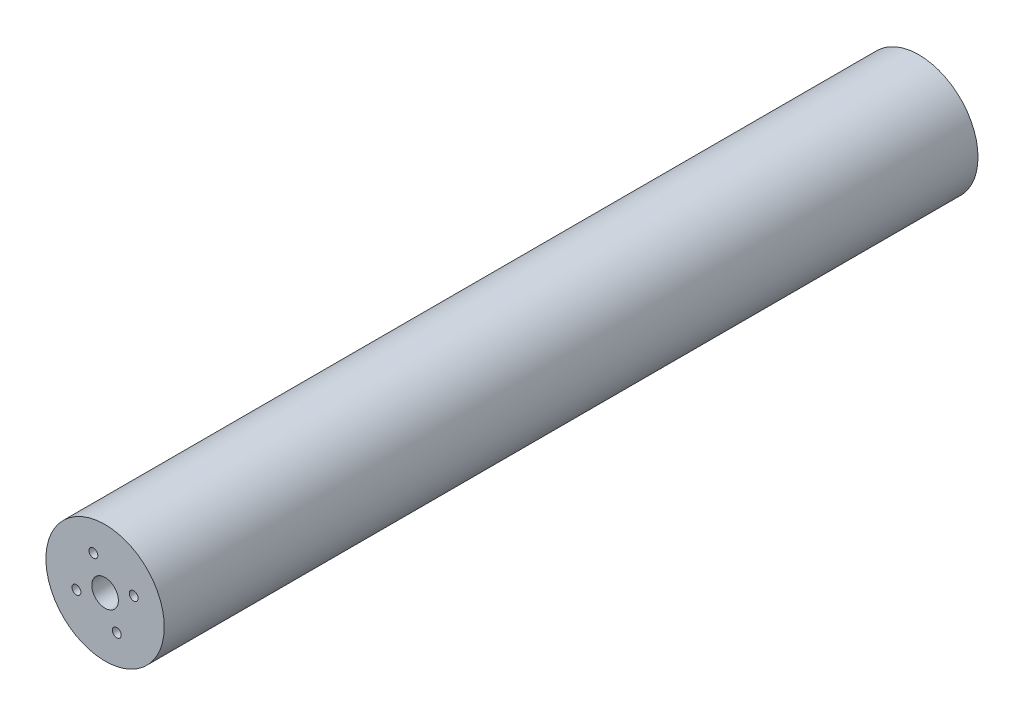
ISO-10303-21;
HEADER;
FILE_DESCRIPTION(('STEP AP214'),'2;1');
FILE_NAME('part.step','',(''),(''),'','','');
FILE_SCHEMA(('AUTOMOTIVE_DESIGN { 1 0 10303 214 1 1 1 1 }'));
ENDSEC;
DATA;
#1=APPLICATION_CONTEXT('core data for automotive mechanical design processes');
#2=APPLICATION_PROTOCOL_DEFINITION('international standard','automotive_design',2000,#1);
#3=PRODUCT_CONTEXT('',#1,'mechanical');
#4=PRODUCT('Part','Part','',(#3));
#5=PRODUCT_RELATED_PRODUCT_CATEGORY('part','',(#4));
#6=PRODUCT_DEFINITION_FORMATION('','',#4);
#7=PRODUCT_DEFINITION_CONTEXT('part definition',#1,'design');
#8=PRODUCT_DEFINITION('design','',#6,#7);
#9=PRODUCT_DEFINITION_SHAPE('','',#8);
#10=(LENGTH_UNIT() NAMED_UNIT(*) SI_UNIT(.MILLI.,.METRE.));
#11=(NAMED_UNIT(*) PLANE_ANGLE_UNIT() SI_UNIT($,.RADIAN.));
#12=(NAMED_UNIT(*) SI_UNIT($,.STERADIAN.) SOLID_ANGLE_UNIT());
#13=UNCERTAINTY_MEASURE_WITH_UNIT(LENGTH_MEASURE(1.E-05),#10,'distance_accuracy_value','');
#14=(GEOMETRIC_REPRESENTATION_CONTEXT(3) GLOBAL_UNCERTAINTY_ASSIGNED_CONTEXT((#13)) GLOBAL_UNIT_ASSIGNED_CONTEXT((#10,
#11,#12)) REPRESENTATION_CONTEXT('',''));
#15=CARTESIAN_POINT('',(0.,0.,0.));
#16=DIRECTION('',(0.,0.,1.));
#17=DIRECTION('',(1.,0.,0.));
#18=AXIS2_PLACEMENT_3D('',#15,#16,#17);
#19=CARTESIAN_POINT('',(0.,0.,275.));
#20=DIRECTION('',(0.,0.,-1.));
#21=DIRECTION('',(-1.,0.,0.));
#22=AXIS2_PLACEMENT_3D('',#19,#20,#21);
#23=CYLINDRICAL_SURFACE('',#22,20.);
#24=DIRECTION('',(0.,0.,-1.));
#25=VECTOR('',#24,1.);
#26=CARTESIAN_POINT('',(-19.4871752699051,-4.49999999999995,275.));
#27=LINE('',#26,#25);
#28=CARTESIAN_POINT('',(-19.4871752699051,-4.5,16.));
#29=VERTEX_POINT('',#28);
#30=CARTESIAN_POINT('',(-19.4871752699051,-4.5,11.));
#31=VERTEX_POINT('',#30);
#32=EDGE_CURVE('E11',#29,#31,#27,.T.);
#33=ORIENTED_EDGE('',*,*,#32,.T.);
#34=CARTESIAN_POINT('',(0.,0.,11.));
#35=DIRECTION('',(0.,0.,-1.));
#36=DIRECTION('',(0.,1.,0.));
#37=AXIS2_PLACEMENT_3D('',#34,#35,#36);
#38=CIRCLE('',#37,20.);
#39=CARTESIAN_POINT('',(-19.4871752699051,4.5,11.));
#40=VERTEX_POINT('',#39);
#41=EDGE_CURVE('E250',#31,#40,#38,.T.);
#42=ORIENTED_EDGE('',*,*,#41,.T.);
#43=DIRECTION('',(0.,0.,-1.));
#44=VECTOR('',#43,1.);
#45=CARTESIAN_POINT('',(-19.4871752699051,4.5,275.));
#46=LINE('',#45,#44);
#47=CARTESIAN_POINT('',(-19.4871752699051,4.5,16.));
#48=VERTEX_POINT('',#47);
#49=EDGE_CURVE('E59',#40,#48,#46,.F.);
#50=ORIENTED_EDGE('',*,*,#49,.T.);
#51=CARTESIAN_POINT('',(0.,0.,16.));
#52=DIRECTION('',(0.,0.,1.));
#53=DIRECTION('',(1.,0.,0.));
#54=AXIS2_PLACEMENT_3D('',#51,#52,#53);
#55=CIRCLE('',#54,20.);
#56=EDGE_CURVE('E257',#48,#29,#55,.T.);
#57=ORIENTED_EDGE('',*,*,#56,.T.);
#58=EDGE_LOOP('',(#33,#42,#50,#57));
#59=FACE_BOUND('',#58,.T.);
#60=CARTESIAN_POINT('',(0.,0.,275.));
#61=DIRECTION('',(0.,0.,1.));
#62=DIRECTION('',(1.,0.,0.));
#63=AXIS2_PLACEMENT_3D('',#60,#61,#62);
#64=CIRCLE('',#63,20.);
#65=CARTESIAN_POINT('',(20.,0.,275.));
#66=VERTEX_POINT('',#65);
#67=EDGE_CURVE('E246',#66,#66,#64,.T.);
#68=ORIENTED_EDGE('',*,*,#67,.F.);
#69=EDGE_LOOP('',(#68));
#70=FACE_BOUND('',#69,.T.);
#71=CARTESIAN_POINT('',(0.,0.,0.));
#72=DIRECTION('',(0.,0.,1.));
#73=DIRECTION('',(1.,0.,0.));
#74=AXIS2_PLACEMENT_3D('',#71,#72,#73);
#75=CIRCLE('',#74,20.);
#76=CARTESIAN_POINT('',(20.,0.,0.));
#77=VERTEX_POINT('',#76);
#78=EDGE_CURVE('E237',#77,#77,#75,.T.);
#79=ORIENTED_EDGE('',*,*,#78,.T.);
#80=EDGE_LOOP('',(#79));
#81=FACE_BOUND('',#80,.T.);
#82=ADVANCED_FACE('F51',(#59,#70,#81),#23,.T.);
#83=CARTESIAN_POINT('',(0.,0.,275.));
#84=DIRECTION('',(0.,0.,1.));
#85=DIRECTION('',(1.,0.,0.));
#86=AXIS2_PLACEMENT_3D('',#83,#84,#85);
#87=PLANE('',#86);
#88=CARTESIAN_POINT('',(-9.67253836362059,-3.95531308549498,275.));
#89=DIRECTION('',(0.,0.,1.));
#90=DIRECTION('',(0.,1.,0.));
#91=AXIS2_PLACEMENT_3D('',#88,#89,#90);
#92=CIRCLE('',#91,1.49999999999999);
#93=CARTESIAN_POINT('',(-9.6725383636206,-2.45531308549499,275.));
#94=VERTEX_POINT('',#93);
#95=EDGE_CURVE('E140',#94,#94,#92,.T.);
#96=ORIENTED_EDGE('',*,*,#95,.F.);
#97=EDGE_LOOP('',(#96));
#98=FACE_BOUND('',#97,.T.);
#99=CARTESIAN_POINT('',(3.95531308549495,-9.67253836362061,275.));
#100=DIRECTION('',(0.,0.,1.));
#101=DIRECTION('',(-1.,0.,0.));
#102=AXIS2_PLACEMENT_3D('',#99,#100,#101);
#103=CIRCLE('',#102,1.49999999999999);
#104=CARTESIAN_POINT('',(2.45531308549496,-9.67253836362061,275.));
#105=VERTEX_POINT('',#104);
#106=EDGE_CURVE('E151',#105,#105,#103,.T.);
#107=ORIENTED_EDGE('',*,*,#106,.F.);
#108=EDGE_LOOP('',(#107));
#109=FACE_BOUND('',#108,.T.);
#110=CARTESIAN_POINT('',(9.67253836362057,3.95531308549505,275.));
#111=DIRECTION('',(0.,0.,1.));
#112=DIRECTION('',(0.,-1.,0.));
#113=AXIS2_PLACEMENT_3D('',#110,#111,#112);
#114=CIRCLE('',#113,1.49999999999999);
#115=CARTESIAN_POINT('',(9.67253836362058,2.45531308549506,275.));
#116=VERTEX_POINT('',#115);
#117=EDGE_CURVE('E159',#116,#116,#114,.T.);
#118=ORIENTED_EDGE('',*,*,#117,.F.);
#119=EDGE_LOOP('',(#118));
#120=FACE_BOUND('',#119,.T.);
#121=CARTESIAN_POINT('',(-3.95531308549495,9.67253836362061,275.));
#122=DIRECTION('',(0.,0.,1.));
#123=DIRECTION('',(1.,0.,0.));
#124=AXIS2_PLACEMENT_3D('',#121,#122,#123);
#125=CIRCLE('',#124,1.49999999999999);
#126=CARTESIAN_POINT('',(-2.45531308549496,9.67253836362061,275.));
#127=VERTEX_POINT('',#126);
#128=EDGE_CURVE('E139',#127,#127,#125,.T.);
#129=ORIENTED_EDGE('',*,*,#128,.F.);
#130=EDGE_LOOP('',(#129));
#131=FACE_BOUND('',#130,.T.);
#132=CARTESIAN_POINT('',(0.,0.,275.));
#133=DIRECTION('',(0.,0.,-1.));
#134=DIRECTION('',(-1.,0.,0.));
#135=AXIS2_PLACEMENT_3D('',#132,#133,#134);
#136=CIRCLE('',#135,4.5);
#137=CARTESIAN_POINT('',(-4.5,0.,275.));
#138=VERTEX_POINT('',#137);
#139=EDGE_CURVE('E170',#138,#138,#136,.T.);
#140=ORIENTED_EDGE('',*,*,#139,.T.);
#141=EDGE_LOOP('',(#140));
#142=FACE_BOUND('',#141,.T.);
#143=ORIENTED_EDGE('',*,*,#67,.T.);
#144=EDGE_LOOP('',(#143));
#145=FACE_BOUND('',#144,.T.);
#146=ADVANCED_FACE('F286',(#98,#109,#120,#131,#142,#145),#87,.T.);
#147=CARTESIAN_POINT('',(0.,0.,0.));
#148=DIRECTION('',(0.,0.,1.));
#149=DIRECTION('',(1.,0.,0.));
#150=AXIS2_PLACEMENT_3D('',#147,#148,#149);
#151=PLANE('',#150);
#152=CARTESIAN_POINT('',(0.,0.,0.));
#153=DIRECTION('',(0.,0.,-1.));
#154=DIRECTION('',(-1.,0.,0.));
#155=AXIS2_PLACEMENT_3D('',#152,#153,#154);
#156=CIRCLE('',#155,4.5);
#157=CARTESIAN_POINT('',(-4.5,0.,0.));
#158=VERTEX_POINT('',#157);
#159=EDGE_CURVE('E169',#158,#158,#156,.T.);
#160=ORIENTED_EDGE('',*,*,#159,.F.);
#161=EDGE_LOOP('',(#160));
#162=FACE_BOUND('',#161,.T.);
#163=ORIENTED_EDGE('',*,*,#78,.F.);
#164=EDGE_LOOP('',(#163));
#165=FACE_BOUND('',#164,.T.);
#166=ADVANCED_FACE('F277',(#162,#165),#151,.F.);
#167=CARTESIAN_POINT('',(-12.,4.5,16.));
#168=DIRECTION('',(0.,0.,1.));
#169=DIRECTION('',(1.,0.,0.));
#170=AXIS2_PLACEMENT_3D('',#167,#168,#169);
#171=PLANE('',#170);
#172=DIRECTION('',(-1.,0.,0.));
#173=VECTOR('',#172,1.);
#174=CARTESIAN_POINT('',(-12.,4.5,16.));
#175=LINE('',#174,#173);
#176=CARTESIAN_POINT('',(-16.,4.5,16.));
#177=VERTEX_POINT('',#176);
#178=EDGE_CURVE('E66',#177,#48,#175,.T.);
#179=ORIENTED_EDGE('',*,*,#178,.F.);
#180=DIRECTION('',(0.,1.,0.));
#181=VECTOR('',#180,1.);
#182=CARTESIAN_POINT('',(-16.,4.5,16.));
#183=LINE('',#182,#181);
#184=CARTESIAN_POINT('',(-16.,-4.5,16.));
#185=VERTEX_POINT('',#184);
#186=EDGE_CURVE('E213',#185,#177,#183,.T.);
#187=ORIENTED_EDGE('',*,*,#186,.F.);
#188=DIRECTION('',(-1.,0.,0.));
#189=VECTOR('',#188,1.);
#190=CARTESIAN_POINT('',(-12.,-4.5,16.));
#191=LINE('',#190,#189);
#192=EDGE_CURVE('E73',#185,#29,#191,.T.);
#193=ORIENTED_EDGE('',*,*,#192,.T.);
#194=ORIENTED_EDGE('',*,*,#56,.F.);
#195=EDGE_LOOP('',(#179,#187,#193,#194));
#196=FACE_BOUND('',#195,.T.);
#197=ADVANCED_FACE('F274',(#196),#171,.F.);
#198=CARTESIAN_POINT('',(-12.,-4.5,11.));
#199=DIRECTION('',(0.,-1.,0.));
#200=DIRECTION('',(0.,0.,-1.));
#201=AXIS2_PLACEMENT_3D('',#198,#199,#200);
#202=PLANE('',#201);
#203=ORIENTED_EDGE('',*,*,#192,.F.);
#204=DIRECTION('',(0.,0.,1.));
#205=VECTOR('',#204,1.);
#206=CARTESIAN_POINT('',(-16.,-4.5,11.));
#207=LINE('',#206,#205);
#208=CARTESIAN_POINT('',(-16.,-4.5,11.));
#209=VERTEX_POINT('',#208);
#210=EDGE_CURVE('E174',#209,#185,#207,.T.);
#211=ORIENTED_EDGE('',*,*,#210,.F.);
#212=DIRECTION('',(-1.,0.,0.));
#213=VECTOR('',#212,1.);
#214=CARTESIAN_POINT('',(-12.,-4.5,11.));
#215=LINE('',#214,#213);
#216=EDGE_CURVE('E238',#209,#31,#215,.T.);
#217=ORIENTED_EDGE('',*,*,#216,.T.);
#218=ORIENTED_EDGE('',*,*,#32,.F.);
#219=EDGE_LOOP('',(#203,#211,#217,#218));
#220=FACE_BOUND('',#219,.T.);
#221=ADVANCED_FACE('F276',(#220),#202,.F.);
#222=CARTESIAN_POINT('',(-12.,4.5,11.));
#223=DIRECTION('',(0.,0.,-1.));
#224=DIRECTION('',(0.,1.,0.));
#225=AXIS2_PLACEMENT_3D('',#222,#223,#224);
#226=PLANE('',#225);
#227=ORIENTED_EDGE('',*,*,#216,.F.);
#228=DIRECTION('',(0.,-1.,0.));
#229=VECTOR('',#228,1.);
#230=CARTESIAN_POINT('',(-16.,0.,11.));
#231=LINE('',#230,#229);
#232=CARTESIAN_POINT('',(-16.,4.5,11.));
#233=VERTEX_POINT('',#232);
#234=EDGE_CURVE('E222',#233,#209,#231,.T.);
#235=ORIENTED_EDGE('',*,*,#234,.F.);
#236=DIRECTION('',(-1.,0.,0.));
#237=VECTOR('',#236,1.);
#238=CARTESIAN_POINT('',(-12.,4.5,11.));
#239=LINE('',#238,#237);
#240=EDGE_CURVE('E241',#233,#40,#239,.T.);
#241=ORIENTED_EDGE('',*,*,#240,.T.);
#242=ORIENTED_EDGE('',*,*,#41,.F.);
#243=EDGE_LOOP('',(#227,#235,#241,#242));
#244=FACE_BOUND('',#243,.T.);
#245=ADVANCED_FACE('F270',(#244),#226,.F.);
#246=CARTESIAN_POINT('',(-12.,4.5,11.));
#247=DIRECTION('',(0.,1.,0.));
#248=DIRECTION('',(0.,0.,1.));
#249=AXIS2_PLACEMENT_3D('',#246,#247,#248);
#250=PLANE('',#249);
#251=ORIENTED_EDGE('',*,*,#240,.F.);
#252=DIRECTION('',(0.,0.,-1.));
#253=VECTOR('',#252,1.);
#254=CARTESIAN_POINT('',(-16.,4.5,20.));
#255=LINE('',#254,#253);
#256=EDGE_CURVE('E194',#177,#233,#255,.T.);
#257=ORIENTED_EDGE('',*,*,#256,.F.);
#258=ORIENTED_EDGE('',*,*,#178,.T.);
#259=ORIENTED_EDGE('',*,*,#49,.F.);
#260=EDGE_LOOP('',(#251,#257,#258,#259));
#261=FACE_BOUND('',#260,.T.);
#262=ADVANCED_FACE('F266',(#261),#250,.F.);
#263=CARTESIAN_POINT('',(-12.,0.,0.));
#264=DIRECTION('',(-1.,0.,0.));
#265=DIRECTION('',(0.,0.,1.));
#266=AXIS2_PLACEMENT_3D('',#263,#264,#265);
#267=PLANE('',#266);
#268=DIRECTION('',(0.,1.,0.));
#269=VECTOR('',#268,1.);
#270=CARTESIAN_POINT('',(-12.,0.,7.));
#271=LINE('',#270,#269);
#272=CARTESIAN_POINT('',(-12.,-8.5,7.));
#273=VERTEX_POINT('',#272);
#274=CARTESIAN_POINT('',(-12.,8.5,7.));
#275=VERTEX_POINT('',#274);
#276=EDGE_CURVE('E229',#273,#275,#271,.T.);
#277=ORIENTED_EDGE('',*,*,#276,.F.);
#278=DIRECTION('',(0.,0.,-1.));
#279=VECTOR('',#278,1.);
#280=CARTESIAN_POINT('',(-12.,-8.5,11.));
#281=LINE('',#280,#279);
#282=CARTESIAN_POINT('',(-12.,-8.5,20.));
#283=VERTEX_POINT('',#282);
#284=EDGE_CURVE('E178',#283,#273,#281,.T.);
#285=ORIENTED_EDGE('',*,*,#284,.F.);
#286=DIRECTION('',(0.,-1.,0.));
#287=VECTOR('',#286,1.);
#288=CARTESIAN_POINT('',(-12.,4.5,20.));
#289=LINE('',#288,#287);
#290=CARTESIAN_POINT('',(-12.,8.5,20.));
#291=VERTEX_POINT('',#290);
#292=EDGE_CURVE('E219',#291,#283,#289,.T.);
#293=ORIENTED_EDGE('',*,*,#292,.F.);
#294=DIRECTION('',(0.,0.,1.));
#295=VECTOR('',#294,1.);
#296=CARTESIAN_POINT('',(-12.,8.5,7.));
#297=LINE('',#296,#295);
#298=EDGE_CURVE('E205',#275,#291,#297,.T.);
#299=ORIENTED_EDGE('',*,*,#298,.F.);
#300=EDGE_LOOP('',(#277,#285,#293,#299));
#301=FACE_BOUND('',#300,.T.);
#302=ADVANCED_FACE('F347',(#301),#267,.T.);
#303=CARTESIAN_POINT('',(-16.,0.,7.));
#304=DIRECTION('',(-1.,0.,0.));
#305=DIRECTION('',(0.,0.,1.));
#306=AXIS2_PLACEMENT_3D('',#303,#304,#305);
#307=PLANE('',#306);
#308=ORIENTED_EDGE('',*,*,#210,.T.);
#309=ORIENTED_EDGE('',*,*,#186,.T.);
#310=ORIENTED_EDGE('',*,*,#256,.T.);
#311=ORIENTED_EDGE('',*,*,#234,.T.);
#312=EDGE_LOOP('',(#308,#309,#310,#311));
#313=FACE_BOUND('',#312,.T.);
#314=DIRECTION('',(0.,1.,0.));
#315=VECTOR('',#314,1.);
#316=CARTESIAN_POINT('',(-16.,4.5,20.));
#317=LINE('',#316,#315);
#318=CARTESIAN_POINT('',(-16.,-8.5,20.));
#319=VERTEX_POINT('',#318);
#320=CARTESIAN_POINT('',(-16.,8.5,20.));
#321=VERTEX_POINT('',#320);
#322=EDGE_CURVE('E216',#319,#321,#317,.T.);
#323=ORIENTED_EDGE('',*,*,#322,.F.);
#324=DIRECTION('',(0.,0.,1.));
#325=VECTOR('',#324,1.);
#326=CARTESIAN_POINT('',(-16.,-8.5,11.));
#327=LINE('',#326,#325);
#328=CARTESIAN_POINT('',(-16.,-8.5,7.));
#329=VERTEX_POINT('',#328);
#330=EDGE_CURVE('E186',#329,#319,#327,.T.);
#331=ORIENTED_EDGE('',*,*,#330,.F.);
#332=DIRECTION('',(0.,-1.,0.));
#333=VECTOR('',#332,1.);
#334=CARTESIAN_POINT('',(-16.,0.,7.));
#335=LINE('',#334,#333);
#336=CARTESIAN_POINT('',(-16.,8.5,7.));
#337=VERTEX_POINT('',#336);
#338=EDGE_CURVE('E226',#337,#329,#335,.T.);
#339=ORIENTED_EDGE('',*,*,#338,.F.);
#340=DIRECTION('',(0.,0.,-1.));
#341=VECTOR('',#340,1.);
#342=CARTESIAN_POINT('',(-16.,8.5,20.));
#343=LINE('',#342,#341);
#344=EDGE_CURVE('E197',#321,#337,#343,.T.);
#345=ORIENTED_EDGE('',*,*,#344,.F.);
#346=EDGE_LOOP('',(#323,#331,#339,#345));
#347=FACE_BOUND('',#346,.T.);
#348=ADVANCED_FACE('F272',(#313,#347),#307,.F.);
#349=CARTESIAN_POINT('',(0.,0.,7.));
#350=DIRECTION('',(0.,0.,1.));
#351=DIRECTION('',(1.,0.,0.));
#352=AXIS2_PLACEMENT_3D('',#349,#350,#351);
#353=PLANE('',#352);
#354=ORIENTED_EDGE('',*,*,#276,.T.);
#355=DIRECTION('',(1.,0.,0.));
#356=VECTOR('',#355,1.);
#357=CARTESIAN_POINT('',(-16.,8.5,7.));
#358=LINE('',#357,#356);
#359=EDGE_CURVE('E201',#337,#275,#358,.T.);
#360=ORIENTED_EDGE('',*,*,#359,.F.);
#361=ORIENTED_EDGE('',*,*,#338,.T.);
#362=DIRECTION('',(-1.,0.,0.));
#363=VECTOR('',#362,1.);
#364=CARTESIAN_POINT('',(-12.,-8.5,7.));
#365=LINE('',#364,#363);
#366=EDGE_CURVE('E182',#273,#329,#365,.T.);
#367=ORIENTED_EDGE('',*,*,#366,.F.);
#368=EDGE_LOOP('',(#354,#360,#361,#367));
#369=FACE_BOUND('',#368,.T.);
#370=ADVANCED_FACE('F340',(#369),#353,.T.);
#371=CARTESIAN_POINT('',(0.,0.,20.));
#372=DIRECTION('',(0.,0.,-1.));
#373=DIRECTION('',(-1.,0.,0.));
#374=AXIS2_PLACEMENT_3D('',#371,#372,#373);
#375=PLANE('',#374);
#376=ORIENTED_EDGE('',*,*,#322,.T.);
#377=DIRECTION('',(-1.,0.,0.));
#378=VECTOR('',#377,1.);
#379=CARTESIAN_POINT('',(-12.,8.5,20.));
#380=LINE('',#379,#378);
#381=EDGE_CURVE('E209',#291,#321,#380,.T.);
#382=ORIENTED_EDGE('',*,*,#381,.F.);
#383=ORIENTED_EDGE('',*,*,#292,.T.);
#384=DIRECTION('',(1.,0.,0.));
#385=VECTOR('',#384,1.);
#386=CARTESIAN_POINT('',(-12.,-8.5,20.));
#387=LINE('',#386,#385);
#388=EDGE_CURVE('E190',#319,#283,#387,.T.);
#389=ORIENTED_EDGE('',*,*,#388,.F.);
#390=EDGE_LOOP('',(#376,#382,#383,#389));
#391=FACE_BOUND('',#390,.T.);
#392=ADVANCED_FACE('F336',(#391),#375,.T.);
#393=CARTESIAN_POINT('',(0.,8.5,0.));
#394=DIRECTION('',(0.,-1.,0.));
#395=DIRECTION('',(0.,0.,-1.));
#396=AXIS2_PLACEMENT_3D('',#393,#394,#395);
#397=PLANE('',#396);
#398=ORIENTED_EDGE('',*,*,#344,.T.);
#399=ORIENTED_EDGE('',*,*,#359,.T.);
#400=ORIENTED_EDGE('',*,*,#298,.T.);
#401=ORIENTED_EDGE('',*,*,#381,.T.);
#402=EDGE_LOOP('',(#398,#399,#400,#401));
#403=FACE_BOUND('',#402,.T.);
#404=ADVANCED_FACE('F330',(#403),#397,.T.);
#405=CARTESIAN_POINT('',(0.,-8.5,0.));
#406=DIRECTION('',(0.,1.,0.));
#407=DIRECTION('',(0.,0.,1.));
#408=AXIS2_PLACEMENT_3D('',#405,#406,#407);
#409=PLANE('',#408);
#410=ORIENTED_EDGE('',*,*,#284,.T.);
#411=ORIENTED_EDGE('',*,*,#366,.T.);
#412=ORIENTED_EDGE('',*,*,#330,.T.);
#413=ORIENTED_EDGE('',*,*,#388,.T.);
#414=EDGE_LOOP('',(#410,#411,#412,#413));
#415=FACE_BOUND('',#414,.T.);
#416=ADVANCED_FACE('F319',(#415),#409,.T.);
#417=CARTESIAN_POINT('',(0.,0.,275.));
#418=DIRECTION('',(0.,0.,-1.));
#419=DIRECTION('',(-1.,0.,0.));
#420=AXIS2_PLACEMENT_3D('',#417,#418,#419);
#421=CYLINDRICAL_SURFACE('',#420,4.5);
#422=ORIENTED_EDGE('',*,*,#139,.F.);
#423=EDGE_LOOP('',(#422));
#424=FACE_BOUND('',#423,.T.);
#425=ORIENTED_EDGE('',*,*,#159,.T.);
#426=EDGE_LOOP('',(#425));
#427=FACE_BOUND('',#426,.T.);
#428=ADVANCED_FACE('F315',(#424,#427),#421,.F.);
#429=CARTESIAN_POINT('',(-3.95531308549495,9.67253836362061,270.));
#430=DIRECTION('',(0.,0.,1.));
#431=DIRECTION('',(1.,0.,0.));
#432=AXIS2_PLACEMENT_3D('',#429,#430,#431);
#433=CONICAL_SURFACE('',#432,1.49999999999997,1.02974425867664);
#434=CARTESIAN_POINT('',(-3.95531308549495,9.67253836362061,269.098709071459));
#435=VERTEX_POINT('',#434);
#436=VERTEX_LOOP('',#435);
#437=FACE_BOUND('',#436,.T.);
#438=CARTESIAN_POINT('',(-3.95531308549495,9.67253836362061,270.));
#439=DIRECTION('',(0.,0.,1.));
#440=DIRECTION('',(1.,0.,0.));
#441=AXIS2_PLACEMENT_3D('',#438,#439,#440);
#442=CIRCLE('',#441,1.49999999999997);
#443=CARTESIAN_POINT('',(-2.45531308549498,9.67253836362061,270.));
#444=VERTEX_POINT('',#443);
#445=EDGE_CURVE('E145',#444,#444,#442,.T.);
#446=ORIENTED_EDGE('',*,*,#445,.T.);
#447=EDGE_LOOP('',(#446));
#448=FACE_BOUND('',#447,.T.);
#449=ADVANCED_FACE('F318',(#437,#448),#433,.F.);
#450=CARTESIAN_POINT('',(-3.95531308549495,9.67253836362061,275.));
#451=DIRECTION('',(0.,0.,1.));
#452=DIRECTION('',(1.,0.,0.));
#453=AXIS2_PLACEMENT_3D('',#450,#451,#452);
#454=CYLINDRICAL_SURFACE('',#453,1.49999999999998);
#455=ORIENTED_EDGE('',*,*,#445,.F.);
#456=EDGE_LOOP('',(#455));
#457=FACE_BOUND('',#456,.T.);
#458=ORIENTED_EDGE('',*,*,#128,.T.);
#459=EDGE_LOOP('',(#458));
#460=FACE_BOUND('',#459,.T.);
#461=ADVANCED_FACE('F326',(#457,#460),#454,.F.);
#462=CARTESIAN_POINT('',(9.67253836362057,3.95531308549505,270.));
#463=DIRECTION('',(0.,0.,1.));
#464=DIRECTION('',(0.,-1.,0.));
#465=AXIS2_PLACEMENT_3D('',#462,#463,#464);
#466=CONICAL_SURFACE('',#465,1.49999999999997,1.02974425867664);
#467=CARTESIAN_POINT('',(9.67253836362057,3.95531308549505,269.098709071459));
#468=VERTEX_POINT('',#467);
#469=VERTEX_LOOP('',#468);
#470=FACE_BOUND('',#469,.T.);
#471=CARTESIAN_POINT('',(9.67253836362057,3.95531308549505,270.));
#472=DIRECTION('',(0.,0.,1.));
#473=DIRECTION('',(0.,-1.,0.));
#474=AXIS2_PLACEMENT_3D('',#471,#472,#473);
#475=CIRCLE('',#474,1.49999999999997);
#476=CARTESIAN_POINT('',(9.67253836362058,2.45531308549508,270.));
#477=VERTEX_POINT('',#476);
#478=EDGE_CURVE('E155',#477,#477,#475,.T.);
#479=ORIENTED_EDGE('',*,*,#478,.T.);
#480=EDGE_LOOP('',(#479));
#481=FACE_BOUND('',#480,.T.);
#482=ADVANCED_FACE('F420',(#470,#481),#466,.F.);
#483=CARTESIAN_POINT('',(9.67253836362057,3.95531308549505,275.));
#484=DIRECTION('',(0.,0.,1.));
#485=DIRECTION('',(0.,-1.,0.));
#486=AXIS2_PLACEMENT_3D('',#483,#484,#485);
#487=CYLINDRICAL_SURFACE('',#486,1.49999999999998);
#488=ORIENTED_EDGE('',*,*,#478,.F.);
#489=EDGE_LOOP('',(#488));
#490=FACE_BOUND('',#489,.T.);
#491=ORIENTED_EDGE('',*,*,#117,.T.);
#492=EDGE_LOOP('',(#491));
#493=FACE_BOUND('',#492,.T.);
#494=ADVANCED_FACE('F431',(#490,#493),#487,.F.);
#495=CARTESIAN_POINT('',(3.95531308549495,-9.67253836362061,270.));
#496=DIRECTION('',(0.,0.,1.));
#497=DIRECTION('',(-1.,0.,0.));
#498=AXIS2_PLACEMENT_3D('',#495,#496,#497);
#499=CONICAL_SURFACE('',#498,1.49999999999997,1.02974425867664);
#500=CARTESIAN_POINT('',(3.95531308549495,-9.67253836362061,269.098709071459));
#501=VERTEX_POINT('',#500);
#502=VERTEX_LOOP('',#501);
#503=FACE_BOUND('',#502,.T.);
#504=CARTESIAN_POINT('',(3.95531308549495,-9.67253836362061,270.));
#505=DIRECTION('',(0.,0.,1.));
#506=DIRECTION('',(-1.,0.,0.));
#507=AXIS2_PLACEMENT_3D('',#504,#505,#506);
#508=CIRCLE('',#507,1.49999999999997);
#509=CARTESIAN_POINT('',(2.45531308549498,-9.67253836362061,270.));
#510=VERTEX_POINT('',#509);
#511=EDGE_CURVE('E148',#510,#510,#508,.T.);
#512=ORIENTED_EDGE('',*,*,#511,.T.);
#513=EDGE_LOOP('',(#512));
#514=FACE_BOUND('',#513,.T.);
#515=ADVANCED_FACE('F444',(#503,#514),#499,.F.);
#516=CARTESIAN_POINT('',(3.95531308549495,-9.67253836362061,275.));
#517=DIRECTION('',(0.,0.,1.));
#518=DIRECTION('',(-1.,0.,0.));
#519=AXIS2_PLACEMENT_3D('',#516,#517,#518);
#520=CYLINDRICAL_SURFACE('',#519,1.49999999999998);
#521=ORIENTED_EDGE('',*,*,#511,.F.);
#522=EDGE_LOOP('',(#521));
#523=FACE_BOUND('',#522,.T.);
#524=ORIENTED_EDGE('',*,*,#106,.T.);
#525=EDGE_LOOP('',(#524));
#526=FACE_BOUND('',#525,.T.);
#527=ADVANCED_FACE('F132',(#523,#526),#520,.F.);
#528=CARTESIAN_POINT('',(-9.67253836362059,-3.95531308549498,270.));
#529=DIRECTION('',(0.,0.,1.));
#530=DIRECTION('',(0.,1.,0.));
#531=AXIS2_PLACEMENT_3D('',#528,#529,#530);
#532=CONICAL_SURFACE('',#531,1.49999999999997,1.02974425867664);
#533=CARTESIAN_POINT('',(-9.67253836362059,-3.95531308549498,269.098709071459));
#534=VERTEX_POINT('',#533);
#535=VERTEX_LOOP('',#534);
#536=FACE_BOUND('',#535,.T.);
#537=CARTESIAN_POINT('',(-9.67253836362059,-3.95531308549498,270.));
#538=DIRECTION('',(0.,0.,1.));
#539=DIRECTION('',(0.,1.,0.));
#540=AXIS2_PLACEMENT_3D('',#537,#538,#539);
#541=CIRCLE('',#540,1.49999999999997);
#542=CARTESIAN_POINT('',(-9.6725383636206,-2.45531308549502,270.));
#543=VERTEX_POINT('',#542);
#544=EDGE_CURVE('E136',#543,#543,#541,.T.);
#545=ORIENTED_EDGE('',*,*,#544,.T.);
#546=EDGE_LOOP('',(#545));
#547=FACE_BOUND('',#546,.T.);
#548=ADVANCED_FACE('F128',(#536,#547),#532,.F.);
#549=CARTESIAN_POINT('',(-9.67253836362059,-3.95531308549498,275.));
#550=DIRECTION('',(0.,0.,1.));
#551=DIRECTION('',(0.,1.,0.));
#552=AXIS2_PLACEMENT_3D('',#549,#550,#551);
#553=CYLINDRICAL_SURFACE('',#552,1.49999999999998);
#554=ORIENTED_EDGE('',*,*,#544,.F.);
#555=EDGE_LOOP('',(#554));
#556=FACE_BOUND('',#555,.T.);
#557=ORIENTED_EDGE('',*,*,#95,.T.);
#558=EDGE_LOOP('',(#557));
#559=FACE_BOUND('',#558,.T.);
#560=ADVANCED_FACE('F131',(#556,#559),#553,.F.);
#561=CLOSED_SHELL('',(#82,#146,#166,#197,#221,#245,#262,#302,#348,#370,#392,#404,#416,#428,#449,
#461,#482,#494,#515,#527,#548,#560));
#562=MANIFOLD_SOLID_BREP('B2',#561);
#563=ADVANCED_BREP_SHAPE_REPRESENTATION('',(#18,#562),#14);
#564=SHAPE_DEFINITION_REPRESENTATION(#9,#563);
ENDSEC;
END-ISO-10303-21;
